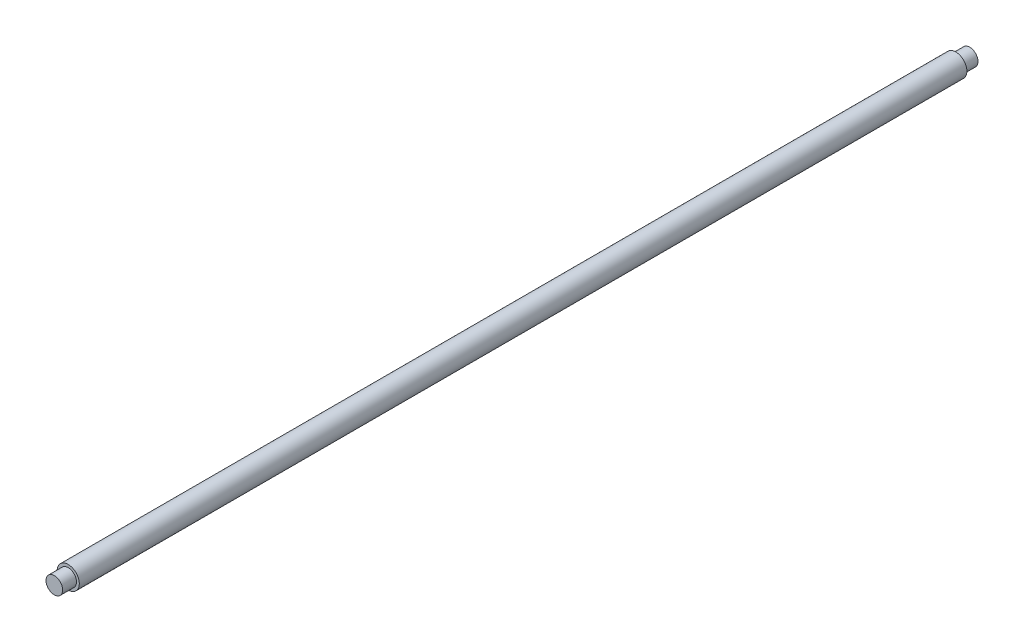
ISO-10303-21;
HEADER;
FILE_DESCRIPTION(('STEP AP214'),'2;1');
FILE_NAME('part.step','',(''),(''),'','','');
FILE_SCHEMA(('AUTOMOTIVE_DESIGN { 1 0 10303 214 1 1 1 1 }'));
ENDSEC;
DATA;
#1=APPLICATION_CONTEXT('core data for automotive mechanical design processes');
#2=APPLICATION_PROTOCOL_DEFINITION('international standard','automotive_design',2000,#1);
#3=PRODUCT_CONTEXT('',#1,'mechanical');
#4=PRODUCT('Part','Part','',(#3));
#5=PRODUCT_RELATED_PRODUCT_CATEGORY('part','',(#4));
#6=PRODUCT_DEFINITION_FORMATION('','',#4);
#7=PRODUCT_DEFINITION_CONTEXT('part definition',#1,'design');
#8=PRODUCT_DEFINITION('design','',#6,#7);
#9=PRODUCT_DEFINITION_SHAPE('','',#8);
#10=(LENGTH_UNIT() NAMED_UNIT(*) SI_UNIT(.MILLI.,.METRE.));
#11=(NAMED_UNIT(*) PLANE_ANGLE_UNIT() SI_UNIT($,.RADIAN.));
#12=(NAMED_UNIT(*) SI_UNIT($,.STERADIAN.) SOLID_ANGLE_UNIT());
#13=UNCERTAINTY_MEASURE_WITH_UNIT(LENGTH_MEASURE(1.E-05),#10,'distance_accuracy_value','');
#14=(GEOMETRIC_REPRESENTATION_CONTEXT(3) GLOBAL_UNCERTAINTY_ASSIGNED_CONTEXT((#13)) GLOBAL_UNIT_ASSIGNED_CONTEXT((#10,
#11,#12)) REPRESENTATION_CONTEXT('',''));
#15=CARTESIAN_POINT('',(0.,0.,0.));
#16=DIRECTION('',(0.,0.,1.));
#17=DIRECTION('',(1.,0.,0.));
#18=AXIS2_PLACEMENT_3D('',#15,#16,#17);
#19=CARTESIAN_POINT('',(0.,0.,330.));
#20=DIRECTION('',(0.,0.,-1.));
#21=DIRECTION('',(-1.,0.,0.));
#22=AXIS2_PLACEMENT_3D('',#19,#20,#21);
#23=CYLINDRICAL_SURFACE('',#22,3.);
#24=CARTESIAN_POINT('',(0.,0.,330.));
#25=DIRECTION('',(0.,0.,1.));
#26=DIRECTION('',(1.,0.,0.));
#27=AXIS2_PLACEMENT_3D('',#24,#25,#26);
#28=CIRCLE('',#27,3.);
#29=CARTESIAN_POINT('',(3.,0.,330.));
#30=VERTEX_POINT('',#29);
#31=EDGE_CURVE('E49',#30,#30,#28,.T.);
#32=ORIENTED_EDGE('',*,*,#31,.F.);
#33=EDGE_LOOP('',(#32));
#34=FACE_BOUND('',#33,.T.);
#35=CARTESIAN_POINT('',(0.,0.,325.));
#36=DIRECTION('',(0.,0.,-1.));
#37=DIRECTION('',(-1.,0.,0.));
#38=AXIS2_PLACEMENT_3D('',#35,#36,#37);
#39=CIRCLE('',#38,3.);
#40=CARTESIAN_POINT('',(-3.,0.,325.));
#41=VERTEX_POINT('',#40);
#42=EDGE_CURVE('E10',#41,#41,#39,.T.);
#43=ORIENTED_EDGE('',*,*,#42,.F.);
#44=EDGE_LOOP('',(#43));
#45=FACE_BOUND('',#44,.T.);
#46=ADVANCED_FACE('F41',(#34,#45),#23,.T.);
#47=CARTESIAN_POINT('',(0.,0.,330.));
#48=DIRECTION('',(0.,0.,1.));
#49=DIRECTION('',(1.,0.,0.));
#50=AXIS2_PLACEMENT_3D('',#47,#48,#49);
#51=PLANE('',#50);
#52=ORIENTED_EDGE('',*,*,#31,.T.);
#53=EDGE_LOOP('',(#52));
#54=FACE_BOUND('',#53,.T.);
#55=ADVANCED_FACE('F83',(#54),#51,.T.);
#56=CARTESIAN_POINT('',(0.,0.,325.));
#57=DIRECTION('',(0.,0.,-1.));
#58=DIRECTION('',(-1.,0.,0.));
#59=AXIS2_PLACEMENT_3D('',#56,#57,#58);
#60=CYLINDRICAL_SURFACE('',#59,4.);
#61=CARTESIAN_POINT('',(0.,0.,325.));
#62=DIRECTION('',(0.,0.,-1.));
#63=DIRECTION('',(-1.,0.,0.));
#64=AXIS2_PLACEMENT_3D('',#61,#62,#63);
#65=CIRCLE('',#64,4.);
#66=CARTESIAN_POINT('',(-4.,0.,325.));
#67=VERTEX_POINT('',#66);
#68=EDGE_CURVE('E67',#67,#67,#65,.T.);
#69=ORIENTED_EDGE('',*,*,#68,.T.);
#70=EDGE_LOOP('',(#69));
#71=FACE_BOUND('',#70,.T.);
#72=CARTESIAN_POINT('',(0.,0.,5.));
#73=DIRECTION('',(0.,0.,-1.));
#74=DIRECTION('',(-1.,0.,0.));
#75=AXIS2_PLACEMENT_3D('',#72,#73,#74);
#76=CIRCLE('',#75,4.);
#77=CARTESIAN_POINT('',(-4.,0.,5.));
#78=VERTEX_POINT('',#77);
#79=EDGE_CURVE('E63',#78,#78,#76,.T.);
#80=ORIENTED_EDGE('',*,*,#79,.F.);
#81=EDGE_LOOP('',(#80));
#82=FACE_BOUND('',#81,.T.);
#83=ADVANCED_FACE('F80',(#71,#82),#60,.T.);
#84=CARTESIAN_POINT('',(0.,0.,325.));
#85=DIRECTION('',(0.,0.,-1.));
#86=DIRECTION('',(-1.,0.,0.));
#87=AXIS2_PLACEMENT_3D('',#84,#85,#86);
#88=PLANE('',#87);
#89=ORIENTED_EDGE('',*,*,#42,.T.);
#90=EDGE_LOOP('',(#89));
#91=FACE_BOUND('',#90,.T.);
#92=ORIENTED_EDGE('',*,*,#68,.F.);
#93=EDGE_LOOP('',(#92));
#94=FACE_BOUND('',#93,.T.);
#95=ADVANCED_FACE('F82',(#91,#94),#88,.F.);
#96=CARTESIAN_POINT('',(0.,0.,5.));
#97=DIRECTION('',(0.,0.,-1.));
#98=DIRECTION('',(-1.,0.,0.));
#99=AXIS2_PLACEMENT_3D('',#96,#97,#98);
#100=PLANE('',#99);
#101=CARTESIAN_POINT('',(0.,0.,5.));
#102=DIRECTION('',(0.,0.,-1.));
#103=DIRECTION('',(-1.,0.,0.));
#104=AXIS2_PLACEMENT_3D('',#101,#102,#103);
#105=CIRCLE('',#104,3.);
#106=CARTESIAN_POINT('',(-3.,0.,5.));
#107=VERTEX_POINT('',#106);
#108=EDGE_CURVE('E60',#107,#107,#105,.T.);
#109=ORIENTED_EDGE('',*,*,#108,.F.);
#110=EDGE_LOOP('',(#109));
#111=FACE_BOUND('',#110,.T.);
#112=ORIENTED_EDGE('',*,*,#79,.T.);
#113=EDGE_LOOP('',(#112));
#114=FACE_BOUND('',#113,.T.);
#115=ADVANCED_FACE('F78',(#111,#114),#100,.T.);
#116=CARTESIAN_POINT('',(0.,0.,0.));
#117=DIRECTION('',(0.,0.,1.));
#118=DIRECTION('',(1.,0.,0.));
#119=AXIS2_PLACEMENT_3D('',#116,#117,#118);
#120=PLANE('',#119);
#121=CARTESIAN_POINT('',(0.,0.,0.));
#122=DIRECTION('',(0.,0.,1.));
#123=DIRECTION('',(1.,0.,0.));
#124=AXIS2_PLACEMENT_3D('',#121,#122,#123);
#125=CIRCLE('',#124,3.);
#126=CARTESIAN_POINT('',(3.,0.,0.));
#127=VERTEX_POINT('',#126);
#128=EDGE_CURVE('E54',#127,#127,#125,.T.);
#129=ORIENTED_EDGE('',*,*,#128,.F.);
#130=EDGE_LOOP('',(#129));
#131=FACE_BOUND('',#130,.T.);
#132=ADVANCED_FACE('F98',(#131),#120,.F.);
#133=ORIENTED_EDGE('',*,*,#108,.T.);
#134=EDGE_LOOP('',(#133));
#135=FACE_BOUND('',#134,.T.);
#136=ORIENTED_EDGE('',*,*,#128,.T.);
#137=EDGE_LOOP('',(#136));
#138=FACE_BOUND('',#137,.T.);
#139=ADVANCED_FACE('F43',(#135,#138),#23,.T.);
#140=CLOSED_SHELL('',(#46,#55,#83,#95,#115,#132,#139));
#141=MANIFOLD_SOLID_BREP('B2',#140);
#142=ADVANCED_BREP_SHAPE_REPRESENTATION('',(#18,#141),#14);
#143=SHAPE_DEFINITION_REPRESENTATION(#9,#142);
ENDSEC;
END-ISO-10303-21;
